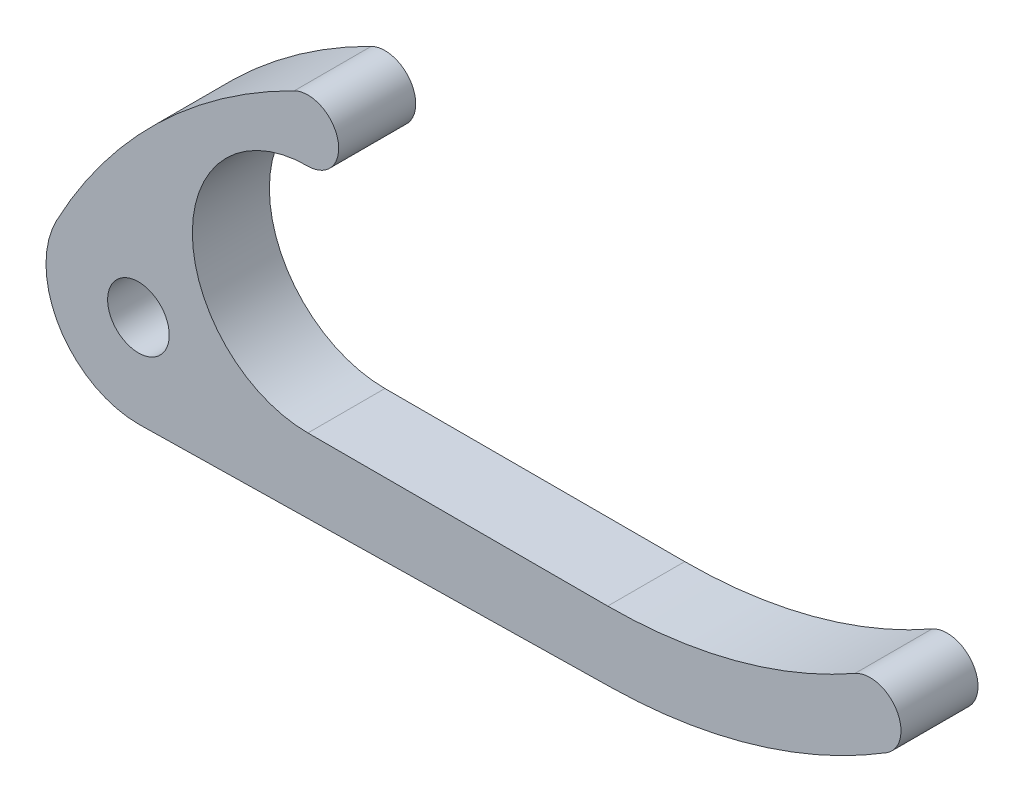
ISO-10303-21;
HEADER;
FILE_DESCRIPTION(('STEP AP214'),'2;1');
FILE_NAME('part.step','',(''),(''),'','','');
FILE_SCHEMA(('AUTOMOTIVE_DESIGN { 1 0 10303 214 1 1 1 1 }'));
ENDSEC;
DATA;
#1=APPLICATION_CONTEXT('core data for automotive mechanical design processes');
#2=APPLICATION_PROTOCOL_DEFINITION('international standard','automotive_design',2000,#1);
#3=PRODUCT_CONTEXT('',#1,'mechanical');
#4=PRODUCT('Part','Part','',(#3));
#5=PRODUCT_RELATED_PRODUCT_CATEGORY('part','',(#4));
#6=PRODUCT_DEFINITION_FORMATION('','',#4);
#7=PRODUCT_DEFINITION_CONTEXT('part definition',#1,'design');
#8=PRODUCT_DEFINITION('design','',#6,#7);
#9=PRODUCT_DEFINITION_SHAPE('','',#8);
#10=(LENGTH_UNIT() NAMED_UNIT(*) SI_UNIT(.MILLI.,.METRE.));
#11=(NAMED_UNIT(*) PLANE_ANGLE_UNIT() SI_UNIT($,.RADIAN.));
#12=(NAMED_UNIT(*) SI_UNIT($,.STERADIAN.) SOLID_ANGLE_UNIT());
#13=UNCERTAINTY_MEASURE_WITH_UNIT(LENGTH_MEASURE(1.E-05),#10,'distance_accuracy_value','');
#14=(GEOMETRIC_REPRESENTATION_CONTEXT(3) GLOBAL_UNCERTAINTY_ASSIGNED_CONTEXT((#13)) GLOBAL_UNIT_ASSIGNED_CONTEXT((#10,
#11,#12)) REPRESENTATION_CONTEXT('',''));
#15=CARTESIAN_POINT('',(0.,0.,0.));
#16=DIRECTION('',(0.,0.,1.));
#17=DIRECTION('',(1.,0.,0.));
#18=AXIS2_PLACEMENT_3D('',#15,#16,#17);
#19=CARTESIAN_POINT('',(60.9265499251984,63.,10.));
#20=DIRECTION('',(0.,0.,-1.));
#21=DIRECTION('',(-1.,0.,0.));
#22=AXIS2_PLACEMENT_3D('',#19,#20,#21);
#23=CYLINDRICAL_SURFACE('',#22,65.);
#24=CARTESIAN_POINT('',(60.9265499251984,63.,0.));
#25=DIRECTION('',(0.,0.,1.));
#26=DIRECTION('',(1.,0.,0.));
#27=AXIS2_PLACEMENT_3D('',#24,#25,#26);
#28=CIRCLE('',#27,65.);
#29=CARTESIAN_POINT('',(60.9265499251984,-2.,0.));
#30=VERTEX_POINT('',#29);
#31=CARTESIAN_POINT('',(93.0247275318956,6.47826086956522,0.));
#32=VERTEX_POINT('',#31);
#33=EDGE_CURVE('E137',#30,#32,#28,.T.);
#34=ORIENTED_EDGE('',*,*,#33,.F.);
#35=DIRECTION('',(0.,0.,-1.));
#36=VECTOR('',#35,1.);
#37=CARTESIAN_POINT('',(60.9265499251984,-2.,10.));
#38=LINE('',#37,#36);
#39=CARTESIAN_POINT('',(60.9265499251984,-2.,10.));
#40=VERTEX_POINT('',#39);
#41=EDGE_CURVE('E11',#40,#30,#38,.T.);
#42=ORIENTED_EDGE('',*,*,#41,.F.);
#43=CARTESIAN_POINT('',(60.9265499251984,63.,10.));
#44=DIRECTION('',(0.,0.,1.));
#45=DIRECTION('',(1.,0.,0.));
#46=AXIS2_PLACEMENT_3D('',#43,#44,#45);
#47=CIRCLE('',#46,65.);
#48=CARTESIAN_POINT('',(93.0247275318956,6.47826086956522,10.));
#49=VERTEX_POINT('',#48);
#50=EDGE_CURVE('E159',#40,#49,#47,.T.);
#51=ORIENTED_EDGE('',*,*,#50,.T.);
#52=DIRECTION('',(0.,0.,-1.));
#53=VECTOR('',#52,1.);
#54=CARTESIAN_POINT('',(93.0247275318956,6.47826086956522,10.));
#55=LINE('',#54,#53);
#56=EDGE_CURVE('E89',#49,#32,#55,.T.);
#57=ORIENTED_EDGE('',*,*,#56,.T.);
#58=EDGE_LOOP('',(#34,#42,#51,#57));
#59=FACE_BOUND('',#58,.T.);
#60=ADVANCED_FACE('F35',(#59),#23,.F.);
#61=CARTESIAN_POINT('',(0.,-2.,10.));
#62=DIRECTION('',(0.,1.,0.));
#63=DIRECTION('',(0.,0.,1.));
#64=AXIS2_PLACEMENT_3D('',#61,#62,#63);
#65=PLANE('',#64);
#66=DIRECTION('',(1.,0.,0.));
#67=VECTOR('',#66,1.);
#68=CARTESIAN_POINT('',(0.,-2.,0.));
#69=LINE('',#68,#67);
#70=CARTESIAN_POINT('',(22.,-2.,0.));
#71=VERTEX_POINT('',#70);
#72=EDGE_CURVE('E140',#71,#30,#69,.T.);
#73=ORIENTED_EDGE('',*,*,#72,.F.);
#74=DIRECTION('',(0.,0.,-1.));
#75=VECTOR('',#74,1.);
#76=CARTESIAN_POINT('',(22.,-2.,10.));
#77=LINE('',#76,#75);
#78=CARTESIAN_POINT('',(22.,-2.,10.));
#79=VERTEX_POINT('',#78);
#80=EDGE_CURVE('E43',#79,#71,#77,.T.);
#81=ORIENTED_EDGE('',*,*,#80,.F.);
#82=DIRECTION('',(1.,0.,0.));
#83=VECTOR('',#82,1.);
#84=CARTESIAN_POINT('',(0.,-2.,10.));
#85=LINE('',#84,#83);
#86=EDGE_CURVE('E201',#79,#40,#85,.T.);
#87=ORIENTED_EDGE('',*,*,#86,.T.);
#88=ORIENTED_EDGE('',*,*,#41,.T.);
#89=EDGE_LOOP('',(#73,#81,#87,#88));
#90=FACE_BOUND('',#89,.T.);
#91=ADVANCED_FACE('F180',(#90),#65,.T.);
#92=CARTESIAN_POINT('',(22.,13.,10.));
#93=DIRECTION('',(0.,0.,-1.));
#94=DIRECTION('',(-1.,0.,0.));
#95=AXIS2_PLACEMENT_3D('',#92,#93,#94);
#96=CYLINDRICAL_SURFACE('',#95,15.);
#97=CARTESIAN_POINT('',(22.,13.,0.));
#98=DIRECTION('',(0.,0.,1.));
#99=DIRECTION('',(1.,0.,0.));
#100=AXIS2_PLACEMENT_3D('',#97,#98,#99);
#101=CIRCLE('',#100,15.);
#102=CARTESIAN_POINT('',(22.,28.,0.));
#103=VERTEX_POINT('',#102);
#104=EDGE_CURVE('E143',#103,#71,#101,.T.);
#105=ORIENTED_EDGE('',*,*,#104,.F.);
#106=DIRECTION('',(0.,0.,-1.));
#107=VECTOR('',#106,1.);
#108=CARTESIAN_POINT('',(22.,28.,10.));
#109=LINE('',#108,#107);
#110=CARTESIAN_POINT('',(22.,28.,10.));
#111=VERTEX_POINT('',#110);
#112=EDGE_CURVE('E169',#111,#103,#109,.T.);
#113=ORIENTED_EDGE('',*,*,#112,.F.);
#114=CARTESIAN_POINT('',(22.,13.,10.));
#115=DIRECTION('',(0.,0.,1.));
#116=DIRECTION('',(1.,0.,0.));
#117=AXIS2_PLACEMENT_3D('',#114,#115,#116);
#118=CIRCLE('',#117,15.);
#119=EDGE_CURVE('E176',#111,#79,#118,.T.);
#120=ORIENTED_EDGE('',*,*,#119,.T.);
#121=ORIENTED_EDGE('',*,*,#80,.T.);
#122=EDGE_LOOP('',(#105,#113,#120,#121));
#123=FACE_BOUND('',#122,.T.);
#124=ADVANCED_FACE('F174',(#123),#96,.F.);
#125=CARTESIAN_POINT('',(22.,32.,10.));
#126=DIRECTION('',(0.,0.,-1.));
#127=DIRECTION('',(-1.,0.,0.));
#128=AXIS2_PLACEMENT_3D('',#125,#126,#127);
#129=CYLINDRICAL_SURFACE('',#128,3.99999999999999);
#130=CARTESIAN_POINT('',(22.,32.,0.));
#131=DIRECTION('',(0.,0.,1.));
#132=DIRECTION('',(1.,0.,0.));
#133=AXIS2_PLACEMENT_3D('',#130,#131,#132);
#134=CIRCLE('',#133,3.99999999999999);
#135=CARTESIAN_POINT('',(20.2276511750472,35.5859140595793,0.));
#136=VERTEX_POINT('',#135);
#137=EDGE_CURVE('E146',#103,#136,#134,.T.);
#138=ORIENTED_EDGE('',*,*,#137,.T.);
#139=DIRECTION('',(0.,0.,-1.));
#140=VECTOR('',#139,1.);
#141=CARTESIAN_POINT('',(20.2276511750472,35.5859140595793,10.));
#142=LINE('',#141,#140);
#143=CARTESIAN_POINT('',(20.2276511750472,35.5859140595793,10.));
#144=VERTEX_POINT('',#143);
#145=EDGE_CURVE('E166',#144,#136,#142,.T.);
#146=ORIENTED_EDGE('',*,*,#145,.F.);
#147=CARTESIAN_POINT('',(22.,32.,10.));
#148=DIRECTION('',(0.,0.,1.));
#149=DIRECTION('',(1.,0.,0.));
#150=AXIS2_PLACEMENT_3D('',#147,#148,#149);
#151=CIRCLE('',#150,3.99999999999999);
#152=EDGE_CURVE('E196',#111,#144,#151,.T.);
#153=ORIENTED_EDGE('',*,*,#152,.F.);
#154=ORIENTED_EDGE('',*,*,#112,.T.);
#155=EDGE_LOOP('',(#138,#146,#153,#154));
#156=FACE_BOUND('',#155,.T.);
#157=ADVANCED_FACE('F189',(#156),#129,.T.);
#158=CARTESIAN_POINT('',(51.2437556117212,-27.1675819830583,10.));
#159=DIRECTION('',(0.,0.,-1.));
#160=DIRECTION('',(-1.,0.,0.));
#161=AXIS2_PLACEMENT_3D('',#158,#159,#160);
#162=CYLINDRICAL_SURFACE('',#161,70.);
#163=CARTESIAN_POINT('',(51.2437556117212,-27.1675819830583,0.));
#164=DIRECTION('',(0.,0.,1.));
#165=DIRECTION('',(1.,0.,0.));
#166=AXIS2_PLACEMENT_3D('',#163,#164,#165);
#167=CIRCLE('',#166,70.);
#168=CARTESIAN_POINT('',(-10.6021563334596,5.62087903097758,0.));
#169=VERTEX_POINT('',#168);
#170=EDGE_CURVE('E148',#136,#169,#167,.T.);
#171=ORIENTED_EDGE('',*,*,#170,.T.);
#172=DIRECTION('',(0.,0.,-1.));
#173=VECTOR('',#172,1.);
#174=CARTESIAN_POINT('',(-10.6021563334596,5.62087903097758,10.));
#175=LINE('',#174,#173);
#176=CARTESIAN_POINT('',(-10.6021563334596,5.62087903097758,10.));
#177=VERTEX_POINT('',#176);
#178=EDGE_CURVE('E163',#177,#169,#175,.T.);
#179=ORIENTED_EDGE('',*,*,#178,.F.);
#180=CARTESIAN_POINT('',(51.2437556117212,-27.1675819830583,10.));
#181=DIRECTION('',(0.,0.,1.));
#182=DIRECTION('',(1.,0.,0.));
#183=AXIS2_PLACEMENT_3D('',#180,#181,#182);
#184=CIRCLE('',#183,70.);
#185=EDGE_CURVE('E195',#144,#177,#184,.T.);
#186=ORIENTED_EDGE('',*,*,#185,.F.);
#187=ORIENTED_EDGE('',*,*,#145,.T.);
#188=EDGE_LOOP('',(#171,#179,#186,#187));
#189=FACE_BOUND('',#188,.T.);
#190=ADVANCED_FACE('F193',(#189),#162,.T.);
#191=CARTESIAN_POINT('',(0.,0.,10.));
#192=DIRECTION('',(0.,0.,-1.));
#193=DIRECTION('',(-1.,0.,0.));
#194=AXIS2_PLACEMENT_3D('',#191,#192,#193);
#195=CYLINDRICAL_SURFACE('',#194,12.);
#196=CARTESIAN_POINT('',(0.,0.,0.));
#197=DIRECTION('',(0.,0.,1.));
#198=DIRECTION('',(1.,0.,0.));
#199=AXIS2_PLACEMENT_3D('',#196,#197,#198);
#200=CIRCLE('',#199,12.);
#201=CARTESIAN_POINT('',(0.,-12.,0.));
#202=VERTEX_POINT('',#201);
#203=EDGE_CURVE('E150',#169,#202,#200,.T.);
#204=ORIENTED_EDGE('',*,*,#203,.T.);
#205=DIRECTION('',(0.,0.,-1.));
#206=VECTOR('',#205,1.);
#207=CARTESIAN_POINT('',(0.,-12.,10.));
#208=LINE('',#207,#206);
#209=CARTESIAN_POINT('',(0.,-12.,10.));
#210=VERTEX_POINT('',#209);
#211=EDGE_CURVE('E126',#210,#202,#208,.T.);
#212=ORIENTED_EDGE('',*,*,#211,.F.);
#213=CARTESIAN_POINT('',(0.,0.,10.));
#214=DIRECTION('',(0.,0.,1.));
#215=DIRECTION('',(1.,0.,0.));
#216=AXIS2_PLACEMENT_3D('',#213,#214,#215);
#217=CIRCLE('',#216,12.);
#218=EDGE_CURVE('E117',#177,#210,#217,.T.);
#219=ORIENTED_EDGE('',*,*,#218,.F.);
#220=ORIENTED_EDGE('',*,*,#178,.T.);
#221=EDGE_LOOP('',(#204,#212,#219,#220));
#222=FACE_BOUND('',#221,.T.);
#223=ADVANCED_FACE('F216',(#222),#195,.T.);
#224=CARTESIAN_POINT('',(0.209396980215203,-11.9963449621146,10.));
#225=DIRECTION('',(-0.0174524064373,0.999847695156391,0.));
#226=DIRECTION('',(-0.999847695156391,-0.0174524064373,0.));
#227=AXIS2_PLACEMENT_3D('',#224,#225,#226);
#228=PLANE('',#227);
#229=DIRECTION('',(0.999847695156391,0.0174524064373,0.));
#230=VECTOR('',#229,1.);
#231=CARTESIAN_POINT('',(0.209396980215203,-11.9963449621146,0.));
#232=LINE('',#231,#230);
#233=CARTESIAN_POINT('',(61.3910369562398,-10.9284154639172,0.));
#234=VERTEX_POINT('',#233);
#235=EDGE_CURVE('E125',#202,#234,#232,.T.);
#236=ORIENTED_EDGE('',*,*,#235,.T.);
#237=DIRECTION('',(0.,0.,-1.));
#238=VECTOR('',#237,1.);
#239=CARTESIAN_POINT('',(61.3910369562398,-10.9284154639172,10.));
#240=LINE('',#239,#238);
#241=CARTESIAN_POINT('',(61.3910369562398,-10.9284154639172,10.));
#242=VERTEX_POINT('',#241);
#243=EDGE_CURVE('E122',#242,#234,#240,.T.);
#244=ORIENTED_EDGE('',*,*,#243,.F.);
#245=DIRECTION('',(0.999847695156391,0.0174524064373,0.));
#246=VECTOR('',#245,1.);
#247=CARTESIAN_POINT('',(0.209396980215203,-11.9963449621146,10.));
#248=LINE('',#247,#246);
#249=EDGE_CURVE('E110',#210,#242,#248,.T.);
#250=ORIENTED_EDGE('',*,*,#249,.F.);
#251=ORIENTED_EDGE('',*,*,#211,.T.);
#252=EDGE_LOOP('',(#236,#244,#250,#251));
#253=FACE_BOUND('',#252,.T.);
#254=ADVANCED_FACE('F123',(#253),#228,.F.);
#255=CARTESIAN_POINT('',(60.1693685056288,59.0609231970302,10.));
#256=DIRECTION('',(0.,0.,-1.));
#257=DIRECTION('',(-1.,0.,0.));
#258=AXIS2_PLACEMENT_3D('',#255,#256,#257);
#259=CYLINDRICAL_SURFACE('',#258,70.);
#260=CARTESIAN_POINT('',(60.1693685056288,59.0609231970302,0.));
#261=DIRECTION('',(0.,0.,1.));
#262=DIRECTION('',(1.,0.,0.));
#263=AXIS2_PLACEMENT_3D('',#260,#261,#262);
#264=CIRCLE('',#263,70.);
#265=CARTESIAN_POINT('',(97.1109473632952,-0.397631708910919,0.));
#266=VERTEX_POINT('',#265);
#267=EDGE_CURVE('E82',#234,#266,#264,.T.);
#268=ORIENTED_EDGE('',*,*,#267,.T.);
#269=DIRECTION('',(0.,0.,-1.));
#270=VECTOR('',#269,1.);
#271=CARTESIAN_POINT('',(97.1109473632952,-0.397631708910919,10.));
#272=LINE('',#271,#270);
#273=CARTESIAN_POINT('',(97.1109473632952,-0.397631708910919,10.));
#274=VERTEX_POINT('',#273);
#275=EDGE_CURVE('E127',#274,#266,#272,.T.);
#276=ORIENTED_EDGE('',*,*,#275,.F.);
#277=CARTESIAN_POINT('',(60.1693685056288,59.0609231970302,10.));
#278=DIRECTION('',(0.,0.,1.));
#279=DIRECTION('',(1.,0.,0.));
#280=AXIS2_PLACEMENT_3D('',#277,#278,#279);
#281=CIRCLE('',#280,70.);
#282=EDGE_CURVE('E115',#242,#274,#281,.T.);
#283=ORIENTED_EDGE('',*,*,#282,.F.);
#284=ORIENTED_EDGE('',*,*,#243,.T.);
#285=EDGE_LOOP('',(#268,#276,#283,#284));
#286=FACE_BOUND('',#285,.T.);
#287=ADVANCED_FACE('F129',(#286),#259,.T.);
#288=CARTESIAN_POINT('',(95.,3.,10.));
#289=DIRECTION('',(0.,0.,-1.));
#290=DIRECTION('',(-1.,0.,0.));
#291=AXIS2_PLACEMENT_3D('',#288,#289,#290);
#292=CYLINDRICAL_SURFACE('',#291,4.);
#293=CARTESIAN_POINT('',(95.,3.,0.));
#294=DIRECTION('',(0.,0.,1.));
#295=DIRECTION('',(1.,0.,0.));
#296=AXIS2_PLACEMENT_3D('',#293,#294,#295);
#297=CIRCLE('',#296,4.);
#298=EDGE_CURVE('E154',#266,#32,#297,.T.);
#299=ORIENTED_EDGE('',*,*,#298,.T.);
#300=ORIENTED_EDGE('',*,*,#56,.F.);
#301=CARTESIAN_POINT('',(95.,3.,10.));
#302=DIRECTION('',(0.,0.,1.));
#303=DIRECTION('',(1.,0.,0.));
#304=AXIS2_PLACEMENT_3D('',#301,#302,#303);
#305=CIRCLE('',#304,4.);
#306=EDGE_CURVE('E51',#274,#49,#305,.T.);
#307=ORIENTED_EDGE('',*,*,#306,.F.);
#308=ORIENTED_EDGE('',*,*,#275,.T.);
#309=EDGE_LOOP('',(#299,#300,#307,#308));
#310=FACE_BOUND('',#309,.T.);
#311=ADVANCED_FACE('F224',(#310),#292,.T.);
#312=CARTESIAN_POINT('',(0.,0.,10.));
#313=DIRECTION('',(0.,0.,-1.));
#314=DIRECTION('',(-1.,0.,0.));
#315=AXIS2_PLACEMENT_3D('',#312,#313,#314);
#316=CYLINDRICAL_SURFACE('',#315,4.);
#317=CARTESIAN_POINT('',(0.,0.,10.));
#318=DIRECTION('',(0.,0.,1.));
#319=DIRECTION('',(1.,0.,0.));
#320=AXIS2_PLACEMENT_3D('',#317,#318,#319);
#321=CIRCLE('',#320,4.);
#322=CARTESIAN_POINT('',(4.,0.,10.));
#323=VERTEX_POINT('',#322);
#324=EDGE_CURVE('E131',#323,#323,#321,.T.);
#325=ORIENTED_EDGE('',*,*,#324,.T.);
#326=EDGE_LOOP('',(#325));
#327=FACE_BOUND('',#326,.T.);
#328=CARTESIAN_POINT('',(0.,0.,0.));
#329=DIRECTION('',(0.,0.,1.));
#330=DIRECTION('',(1.,0.,0.));
#331=AXIS2_PLACEMENT_3D('',#328,#329,#330);
#332=CIRCLE('',#331,4.);
#333=CARTESIAN_POINT('',(4.,0.,0.));
#334=VERTEX_POINT('',#333);
#335=EDGE_CURVE('E156',#334,#334,#332,.T.);
#336=ORIENTED_EDGE('',*,*,#335,.F.);
#337=EDGE_LOOP('',(#336));
#338=FACE_BOUND('',#337,.T.);
#339=ADVANCED_FACE('F227',(#327,#338),#316,.F.);
#340=CARTESIAN_POINT('',(0.,0.,10.));
#341=DIRECTION('',(0.,0.,1.));
#342=DIRECTION('',(1.,0.,0.));
#343=AXIS2_PLACEMENT_3D('',#340,#341,#342);
#344=PLANE('',#343);
#345=ORIENTED_EDGE('',*,*,#50,.F.);
#346=ORIENTED_EDGE('',*,*,#86,.F.);
#347=ORIENTED_EDGE('',*,*,#119,.F.);
#348=ORIENTED_EDGE('',*,*,#152,.T.);
#349=ORIENTED_EDGE('',*,*,#185,.T.);
#350=ORIENTED_EDGE('',*,*,#218,.T.);
#351=ORIENTED_EDGE('',*,*,#249,.T.);
#352=ORIENTED_EDGE('',*,*,#282,.T.);
#353=ORIENTED_EDGE('',*,*,#306,.T.);
#354=EDGE_LOOP('',(#345,#346,#347,#348,#349,#350,#351,#352,#353));
#355=FACE_BOUND('',#354,.T.);
#356=ORIENTED_EDGE('',*,*,#324,.F.);
#357=EDGE_LOOP('',(#356));
#358=FACE_BOUND('',#357,.T.);
#359=ADVANCED_FACE('F112',(#355,#358),#344,.T.);
#360=CARTESIAN_POINT('',(0.,0.,0.));
#361=DIRECTION('',(0.,0.,1.));
#362=DIRECTION('',(1.,0.,0.));
#363=AXIS2_PLACEMENT_3D('',#360,#361,#362);
#364=PLANE('',#363);
#365=ORIENTED_EDGE('',*,*,#33,.T.);
#366=ORIENTED_EDGE('',*,*,#298,.F.);
#367=ORIENTED_EDGE('',*,*,#267,.F.);
#368=ORIENTED_EDGE('',*,*,#235,.F.);
#369=ORIENTED_EDGE('',*,*,#203,.F.);
#370=ORIENTED_EDGE('',*,*,#170,.F.);
#371=ORIENTED_EDGE('',*,*,#137,.F.);
#372=ORIENTED_EDGE('',*,*,#104,.T.);
#373=ORIENTED_EDGE('',*,*,#72,.T.);
#374=EDGE_LOOP('',(#365,#366,#367,#368,#369,#370,#371,#372,#373));
#375=FACE_BOUND('',#374,.T.);
#376=ORIENTED_EDGE('',*,*,#335,.T.);
#377=EDGE_LOOP('',(#376));
#378=FACE_BOUND('',#377,.T.);
#379=ADVANCED_FACE('F183',(#375,#378),#364,.F.);
#380=CLOSED_SHELL('',(#60,#91,#124,#157,#190,#223,#254,#287,#311,#339,#359,#379));
#381=MANIFOLD_SOLID_BREP('B2',#380);
#382=ADVANCED_BREP_SHAPE_REPRESENTATION('',(#18,#381),#14);
#383=SHAPE_DEFINITION_REPRESENTATION(#9,#382);
ENDSEC;
END-ISO-10303-21;
